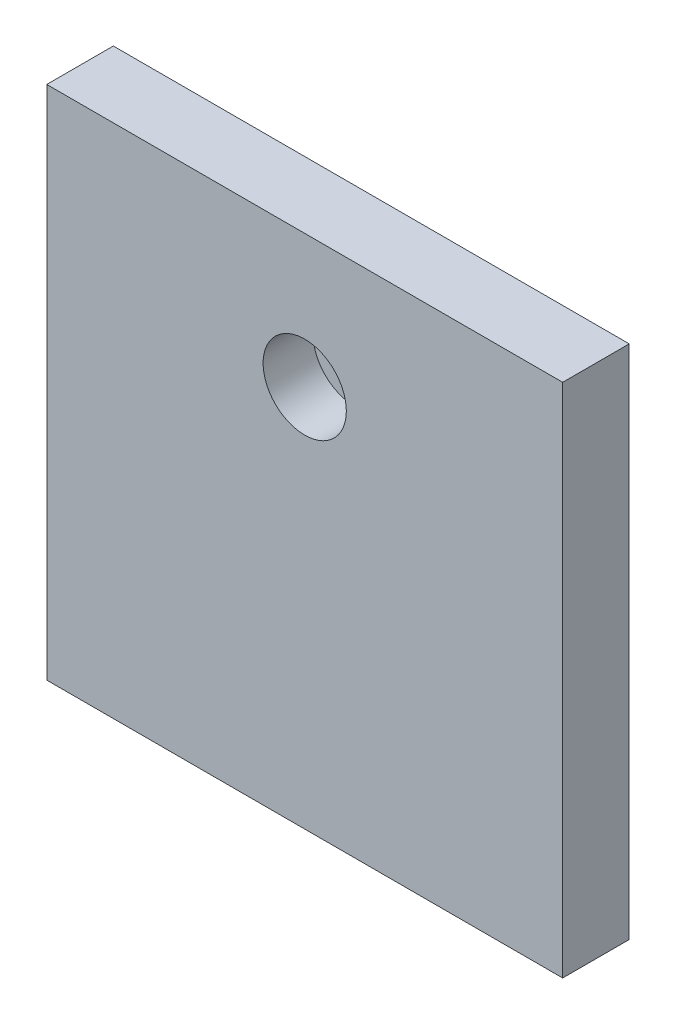
ISO-10303-21;
HEADER;
FILE_DESCRIPTION(('STEP AP214'),'2;1');
FILE_NAME('part.step','',(''),(''),'','','');
FILE_SCHEMA(('AUTOMOTIVE_DESIGN { 1 0 10303 214 1 1 1 1 }'));
ENDSEC;
DATA;
#1=APPLICATION_CONTEXT('core data for automotive mechanical design processes');
#2=APPLICATION_PROTOCOL_DEFINITION('international standard','automotive_design',2000,#1);
#3=PRODUCT_CONTEXT('',#1,'mechanical');
#4=PRODUCT('Part','Part','',(#3));
#5=PRODUCT_RELATED_PRODUCT_CATEGORY('part','',(#4));
#6=PRODUCT_DEFINITION_FORMATION('','',#4);
#7=PRODUCT_DEFINITION_CONTEXT('part definition',#1,'design');
#8=PRODUCT_DEFINITION('design','',#6,#7);
#9=PRODUCT_DEFINITION_SHAPE('','',#8);
#10=(LENGTH_UNIT() NAMED_UNIT(*) SI_UNIT(.MILLI.,.METRE.));
#11=(NAMED_UNIT(*) PLANE_ANGLE_UNIT() SI_UNIT($,.RADIAN.));
#12=(NAMED_UNIT(*) SI_UNIT($,.STERADIAN.) SOLID_ANGLE_UNIT());
#13=UNCERTAINTY_MEASURE_WITH_UNIT(LENGTH_MEASURE(1.E-05),#10,'distance_accuracy_value','');
#14=(GEOMETRIC_REPRESENTATION_CONTEXT(3) GLOBAL_UNCERTAINTY_ASSIGNED_CONTEXT((#13)) GLOBAL_UNIT_ASSIGNED_CONTEXT((#10,
#11,#12)) REPRESENTATION_CONTEXT('',''));
#15=CARTESIAN_POINT('',(0.,0.,0.));
#16=DIRECTION('',(0.,0.,1.));
#17=DIRECTION('',(1.,0.,0.));
#18=AXIS2_PLACEMENT_3D('',#15,#16,#17);
#19=CARTESIAN_POINT('',(15.5,-8.,4.));
#20=DIRECTION('',(0.,0.,-1.));
#21=DIRECTION('',(-1.,0.,0.));
#22=AXIS2_PLACEMENT_3D('',#19,#20,#21);
#23=CYLINDRICAL_SURFACE('',#22,1.25);
#24=CARTESIAN_POINT('',(15.5,-8.,0.));
#25=DIRECTION('',(0.,0.,1.));
#26=DIRECTION('',(1.,0.,0.));
#27=AXIS2_PLACEMENT_3D('',#24,#25,#26);
#28=CIRCLE('',#27,1.25);
#29=CARTESIAN_POINT('',(16.75,-8.,0.));
#30=VERTEX_POINT('',#29);
#31=EDGE_CURVE('E114',#30,#30,#28,.T.);
#32=ORIENTED_EDGE('',*,*,#31,.F.);
#33=EDGE_LOOP('',(#32));
#34=FACE_BOUND('',#33,.T.);
#35=CARTESIAN_POINT('',(15.5,-8.,1.));
#36=DIRECTION('',(0.,0.,1.));
#37=DIRECTION('',(1.,0.,0.));
#38=AXIS2_PLACEMENT_3D('',#35,#36,#37);
#39=CIRCLE('',#38,1.25);
#40=CARTESIAN_POINT('',(16.75,-8.,1.));
#41=VERTEX_POINT('',#40);
#42=EDGE_CURVE('E43',#41,#41,#39,.T.);
#43=ORIENTED_EDGE('',*,*,#42,.T.);
#44=EDGE_LOOP('',(#43));
#45=FACE_BOUND('',#44,.T.);
#46=ADVANCED_FACE('F39',(#34,#45),#23,.F.);
#47=CARTESIAN_POINT('',(0.,0.,4.));
#48=DIRECTION('',(0.,0.,1.));
#49=DIRECTION('',(1.,0.,0.));
#50=AXIS2_PLACEMENT_3D('',#47,#48,#49);
#51=PLANE('',#50);
#52=CARTESIAN_POINT('',(15.5,-8.,4.));
#53=DIRECTION('',(0.,0.,1.));
#54=DIRECTION('',(1.,0.,0.));
#55=AXIS2_PLACEMENT_3D('',#52,#53,#54);
#56=CIRCLE('',#55,2.5);
#57=CARTESIAN_POINT('',(18.,-8.,4.));
#58=VERTEX_POINT('',#57);
#59=EDGE_CURVE('E135',#58,#58,#56,.T.);
#60=ORIENTED_EDGE('',*,*,#59,.F.);
#61=EDGE_LOOP('',(#60));
#62=FACE_BOUND('',#61,.T.);
#63=DIRECTION('',(0.,-1.,0.));
#64=VECTOR('',#63,1.);
#65=CARTESIAN_POINT('',(0.,0.,4.));
#66=LINE('',#65,#64);
#67=CARTESIAN_POINT('',(0.,0.,4.));
#68=VERTEX_POINT('',#67);
#69=CARTESIAN_POINT('',(0.,-31.,4.));
#70=VERTEX_POINT('',#69);
#71=EDGE_CURVE('E93',#68,#70,#66,.T.);
#72=ORIENTED_EDGE('',*,*,#71,.T.);
#73=DIRECTION('',(1.,0.,0.));
#74=VECTOR('',#73,1.);
#75=CARTESIAN_POINT('',(0.,-31.,4.));
#76=LINE('',#75,#74);
#77=CARTESIAN_POINT('',(31.,-31.,4.));
#78=VERTEX_POINT('',#77);
#79=EDGE_CURVE('E88',#70,#78,#76,.T.);
#80=ORIENTED_EDGE('',*,*,#79,.T.);
#81=DIRECTION('',(0.,1.,0.));
#82=VECTOR('',#81,1.);
#83=CARTESIAN_POINT('',(31.,0.,4.));
#84=LINE('',#83,#82);
#85=CARTESIAN_POINT('',(31.,0.,4.));
#86=VERTEX_POINT('',#85);
#87=EDGE_CURVE('E91',#78,#86,#84,.T.);
#88=ORIENTED_EDGE('',*,*,#87,.T.);
#89=DIRECTION('',(-1.,0.,0.));
#90=VECTOR('',#89,1.);
#91=CARTESIAN_POINT('',(0.,0.,4.));
#92=LINE('',#91,#90);
#93=EDGE_CURVE('E58',#86,#68,#92,.T.);
#94=ORIENTED_EDGE('',*,*,#93,.T.);
#95=EDGE_LOOP('',(#72,#80,#88,#94));
#96=FACE_BOUND('',#95,.T.);
#97=ADVANCED_FACE('F89',(#62,#96),#51,.T.);
#98=CARTESIAN_POINT('',(0.,0.,0.));
#99=DIRECTION('',(0.,0.,1.));
#100=DIRECTION('',(1.,0.,0.));
#101=AXIS2_PLACEMENT_3D('',#98,#99,#100);
#102=PLANE('',#101);
#103=DIRECTION('',(0.,-1.,0.));
#104=VECTOR('',#103,1.);
#105=CARTESIAN_POINT('',(0.,0.,0.));
#106=LINE('',#105,#104);
#107=CARTESIAN_POINT('',(0.,0.,0.));
#108=VERTEX_POINT('',#107);
#109=CARTESIAN_POINT('',(0.,-31.,0.));
#110=VERTEX_POINT('',#109);
#111=EDGE_CURVE('E110',#108,#110,#106,.T.);
#112=ORIENTED_EDGE('',*,*,#111,.F.);
#113=DIRECTION('',(-1.,0.,0.));
#114=VECTOR('',#113,1.);
#115=CARTESIAN_POINT('',(0.,0.,0.));
#116=LINE('',#115,#114);
#117=CARTESIAN_POINT('',(31.,0.,0.));
#118=VERTEX_POINT('',#117);
#119=EDGE_CURVE('E81',#118,#108,#116,.T.);
#120=ORIENTED_EDGE('',*,*,#119,.F.);
#121=DIRECTION('',(0.,1.,0.));
#122=VECTOR('',#121,1.);
#123=CARTESIAN_POINT('',(31.,0.,0.));
#124=LINE('',#123,#122);
#125=CARTESIAN_POINT('',(31.,-31.,0.));
#126=VERTEX_POINT('',#125);
#127=EDGE_CURVE('E75',#126,#118,#124,.T.);
#128=ORIENTED_EDGE('',*,*,#127,.F.);
#129=DIRECTION('',(1.,0.,0.));
#130=VECTOR('',#129,1.);
#131=CARTESIAN_POINT('',(0.,-31.,0.));
#132=LINE('',#131,#130);
#133=EDGE_CURVE('E98',#110,#126,#132,.T.);
#134=ORIENTED_EDGE('',*,*,#133,.F.);
#135=EDGE_LOOP('',(#112,#120,#128,#134));
#136=FACE_BOUND('',#135,.T.);
#137=ORIENTED_EDGE('',*,*,#31,.T.);
#138=EDGE_LOOP('',(#137));
#139=FACE_BOUND('',#138,.T.);
#140=ADVANCED_FACE('F127',(#136,#139),#102,.F.);
#141=CARTESIAN_POINT('',(0.,0.,4.));
#142=DIRECTION('',(1.,0.,0.));
#143=DIRECTION('',(0.,1.,0.));
#144=AXIS2_PLACEMENT_3D('',#141,#142,#143);
#145=PLANE('',#144);
#146=ORIENTED_EDGE('',*,*,#111,.T.);
#147=DIRECTION('',(0.,0.,-1.));
#148=VECTOR('',#147,1.);
#149=CARTESIAN_POINT('',(0.,-31.,4.));
#150=LINE('',#149,#148);
#151=EDGE_CURVE('E11',#70,#110,#150,.T.);
#152=ORIENTED_EDGE('',*,*,#151,.F.);
#153=ORIENTED_EDGE('',*,*,#71,.F.);
#154=DIRECTION('',(0.,0.,-1.));
#155=VECTOR('',#154,1.);
#156=CARTESIAN_POINT('',(0.,0.,4.));
#157=LINE('',#156,#155);
#158=EDGE_CURVE('E106',#68,#108,#157,.T.);
#159=ORIENTED_EDGE('',*,*,#158,.T.);
#160=EDGE_LOOP('',(#146,#152,#153,#159));
#161=FACE_BOUND('',#160,.T.);
#162=ADVANCED_FACE('F41',(#161),#145,.F.);
#163=CARTESIAN_POINT('',(0.,-31.,4.));
#164=DIRECTION('',(0.,1.,0.));
#165=DIRECTION('',(0.,0.,1.));
#166=AXIS2_PLACEMENT_3D('',#163,#164,#165);
#167=PLANE('',#166);
#168=ORIENTED_EDGE('',*,*,#133,.T.);
#169=DIRECTION('',(0.,0.,-1.));
#170=VECTOR('',#169,1.);
#171=CARTESIAN_POINT('',(31.,-31.,4.));
#172=LINE('',#171,#170);
#173=EDGE_CURVE('E50',#78,#126,#172,.T.);
#174=ORIENTED_EDGE('',*,*,#173,.F.);
#175=ORIENTED_EDGE('',*,*,#79,.F.);
#176=ORIENTED_EDGE('',*,*,#151,.T.);
#177=EDGE_LOOP('',(#168,#174,#175,#176));
#178=FACE_BOUND('',#177,.T.);
#179=ADVANCED_FACE('F97',(#178),#167,.F.);
#180=CARTESIAN_POINT('',(31.,0.,4.));
#181=DIRECTION('',(-1.,0.,0.));
#182=DIRECTION('',(0.,-1.,0.));
#183=AXIS2_PLACEMENT_3D('',#180,#181,#182);
#184=PLANE('',#183);
#185=ORIENTED_EDGE('',*,*,#127,.T.);
#186=DIRECTION('',(0.,0.,-1.));
#187=VECTOR('',#186,1.);
#188=CARTESIAN_POINT('',(31.,0.,4.));
#189=LINE('',#188,#187);
#190=EDGE_CURVE('E100',#86,#118,#189,.T.);
#191=ORIENTED_EDGE('',*,*,#190,.F.);
#192=ORIENTED_EDGE('',*,*,#87,.F.);
#193=ORIENTED_EDGE('',*,*,#173,.T.);
#194=EDGE_LOOP('',(#185,#191,#192,#193));
#195=FACE_BOUND('',#194,.T.);
#196=ADVANCED_FACE('F102',(#195),#184,.F.);
#197=CARTESIAN_POINT('',(0.,0.,4.));
#198=DIRECTION('',(0.,-1.,0.));
#199=DIRECTION('',(0.,0.,-1.));
#200=AXIS2_PLACEMENT_3D('',#197,#198,#199);
#201=PLANE('',#200);
#202=ORIENTED_EDGE('',*,*,#119,.T.);
#203=ORIENTED_EDGE('',*,*,#158,.F.);
#204=ORIENTED_EDGE('',*,*,#93,.F.);
#205=ORIENTED_EDGE('',*,*,#190,.T.);
#206=EDGE_LOOP('',(#202,#203,#204,#205));
#207=FACE_BOUND('',#206,.T.);
#208=ADVANCED_FACE('F124',(#207),#201,.F.);
#209=CARTESIAN_POINT('',(15.5,-8.,1.));
#210=DIRECTION('',(0.,0.,1.));
#211=DIRECTION('',(1.,0.,0.));
#212=AXIS2_PLACEMENT_3D('',#209,#210,#211);
#213=CYLINDRICAL_SURFACE('',#212,2.5);
#214=CARTESIAN_POINT('',(15.5,-8.,1.));
#215=DIRECTION('',(0.,0.,1.));
#216=DIRECTION('',(1.,0.,0.));
#217=AXIS2_PLACEMENT_3D('',#214,#215,#216);
#218=CIRCLE('',#217,2.5);
#219=CARTESIAN_POINT('',(18.,-8.,1.));
#220=VERTEX_POINT('',#219);
#221=EDGE_CURVE('E139',#220,#220,#218,.T.);
#222=ORIENTED_EDGE('',*,*,#221,.F.);
#223=EDGE_LOOP('',(#222));
#224=FACE_BOUND('',#223,.T.);
#225=ORIENTED_EDGE('',*,*,#59,.T.);
#226=EDGE_LOOP('',(#225));
#227=FACE_BOUND('',#226,.T.);
#228=ADVANCED_FACE('F151',(#224,#227),#213,.F.);
#229=CARTESIAN_POINT('',(15.5,-8.,1.));
#230=DIRECTION('',(0.,0.,1.));
#231=DIRECTION('',(1.,0.,0.));
#232=AXIS2_PLACEMENT_3D('',#229,#230,#231);
#233=PLANE('',#232);
#234=ORIENTED_EDGE('',*,*,#42,.F.);
#235=EDGE_LOOP('',(#234));
#236=FACE_BOUND('',#235,.T.);
#237=ORIENTED_EDGE('',*,*,#221,.T.);
#238=EDGE_LOOP('',(#237));
#239=FACE_BOUND('',#238,.T.);
#240=ADVANCED_FACE('F149',(#236,#239),#233,.T.);
#241=CLOSED_SHELL('',(#46,#97,#140,#162,#179,#196,#208,#228,#240));
#242=MANIFOLD_SOLID_BREP('B2',#241);
#243=ADVANCED_BREP_SHAPE_REPRESENTATION('',(#18,#242),#14);
#244=SHAPE_DEFINITION_REPRESENTATION(#9,#243);
ENDSEC;
END-ISO-10303-21;
